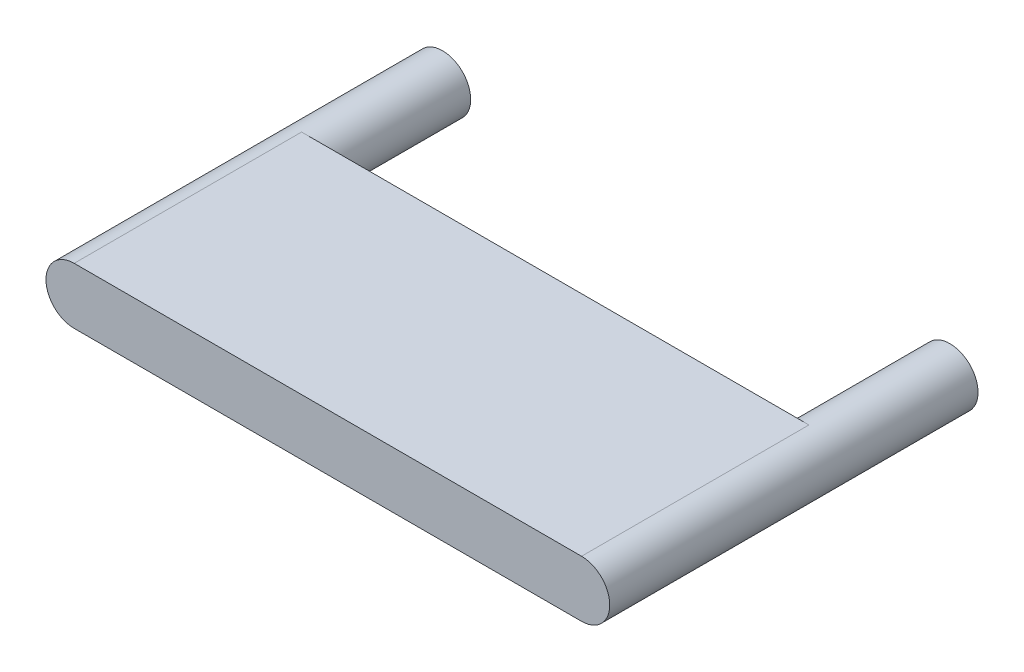
ISO-10303-21;
HEADER;
FILE_DESCRIPTION(('STEP AP214'),'2;1');
FILE_NAME('part.step','',(''),(''),'','','');
FILE_SCHEMA(('AUTOMOTIVE_DESIGN { 1 0 10303 214 1 1 1 1 }'));
ENDSEC;
DATA;
#1=APPLICATION_CONTEXT('core data for automotive mechanical design processes');
#2=APPLICATION_PROTOCOL_DEFINITION('international standard','automotive_design',2000,#1);
#3=PRODUCT_CONTEXT('',#1,'mechanical');
#4=PRODUCT('Part','Part','',(#3));
#5=PRODUCT_RELATED_PRODUCT_CATEGORY('part','',(#4));
#6=PRODUCT_DEFINITION_FORMATION('','',#4);
#7=PRODUCT_DEFINITION_CONTEXT('part definition',#1,'design');
#8=PRODUCT_DEFINITION('design','',#6,#7);
#9=PRODUCT_DEFINITION_SHAPE('','',#8);
#10=(LENGTH_UNIT() NAMED_UNIT(*) SI_UNIT(.MILLI.,.METRE.));
#11=(NAMED_UNIT(*) PLANE_ANGLE_UNIT() SI_UNIT($,.RADIAN.));
#12=(NAMED_UNIT(*) SI_UNIT($,.STERADIAN.) SOLID_ANGLE_UNIT());
#13=UNCERTAINTY_MEASURE_WITH_UNIT(LENGTH_MEASURE(1.E-05),#10,'distance_accuracy_value','');
#14=(GEOMETRIC_REPRESENTATION_CONTEXT(3) GLOBAL_UNCERTAINTY_ASSIGNED_CONTEXT((#13)) GLOBAL_UNIT_ASSIGNED_CONTEXT((#10,
#11,#12)) REPRESENTATION_CONTEXT('',''));
#15=CARTESIAN_POINT('',(0.,0.,0.));
#16=DIRECTION('',(0.,0.,1.));
#17=DIRECTION('',(1.,0.,0.));
#18=AXIS2_PLACEMENT_3D('',#15,#16,#17);
#19=CARTESIAN_POINT('',(22.86,2.54,12.7));
#20=DIRECTION('',(0.,0.,-1.));
#21=DIRECTION('',(-1.,0.,0.));
#22=AXIS2_PLACEMENT_3D('',#19,#20,#21);
#23=CYLINDRICAL_SURFACE('',#22,2.54);
#24=CARTESIAN_POINT('',(22.86,2.54,7.79060814735999));
#25=DIRECTION('',(0.,0.,-1.));
#26=DIRECTION('',(-1.,0.,0.));
#27=AXIS2_PLACEMENT_3D('',#24,#25,#26);
#28=CIRCLE('',#27,2.54);
#29=CARTESIAN_POINT('',(22.86,0.,7.79060814735999));
#30=VERTEX_POINT('',#29);
#31=CARTESIAN_POINT('',(22.86,5.08,7.79060814735999));
#32=VERTEX_POINT('',#31);
#33=EDGE_CURVE('E74',#30,#32,#28,.F.);
#34=ORIENTED_EDGE('',*,*,#33,.F.);
#35=DIRECTION('',(0.,0.,-1.));
#36=VECTOR('',#35,1.);
#37=CARTESIAN_POINT('',(22.86,0.,0.));
#38=LINE('',#37,#36);
#39=CARTESIAN_POINT('',(22.86,0.,-12.7));
#40=VERTEX_POINT('',#39);
#41=EDGE_CURVE('E82',#40,#30,#38,.F.);
#42=ORIENTED_EDGE('',*,*,#41,.F.);
#43=CARTESIAN_POINT('',(22.86,2.54,-12.7));
#44=DIRECTION('',(0.,0.,-1.));
#45=DIRECTION('',(-1.,0.,0.));
#46=AXIS2_PLACEMENT_3D('',#43,#44,#45);
#47=CIRCLE('',#46,2.54);
#48=CARTESIAN_POINT('',(22.86,5.08,-12.7));
#49=VERTEX_POINT('',#48);
#50=EDGE_CURVE('E42',#40,#49,#47,.T.);
#51=ORIENTED_EDGE('',*,*,#50,.T.);
#52=DIRECTION('',(0.,0.,1.));
#53=VECTOR('',#52,1.);
#54=CARTESIAN_POINT('',(22.86,5.08,12.7));
#55=LINE('',#54,#53);
#56=EDGE_CURVE('E84',#32,#49,#55,.F.);
#57=ORIENTED_EDGE('',*,*,#56,.F.);
#58=EDGE_LOOP('',(#34,#42,#51,#57));
#59=FACE_BOUND('',#58,.T.);
#60=CARTESIAN_POINT('',(22.86,2.54,-25.4));
#61=DIRECTION('',(0.,0.,-1.));
#62=DIRECTION('',(-1.,0.,0.));
#63=AXIS2_PLACEMENT_3D('',#60,#61,#62);
#64=CIRCLE('',#63,2.54);
#65=CARTESIAN_POINT('',(20.32,2.54,-25.4));
#66=VERTEX_POINT('',#65);
#67=EDGE_CURVE('E99',#66,#66,#64,.T.);
#68=ORIENTED_EDGE('',*,*,#67,.F.);
#69=EDGE_LOOP('',(#68));
#70=FACE_BOUND('',#69,.T.);
#71=ADVANCED_FACE('F34',(#59,#70),#23,.T.);
#72=CARTESIAN_POINT('',(-22.86,2.54,-12.7));
#73=DIRECTION('',(0.,0.,1.));
#74=DIRECTION('',(1.,0.,0.));
#75=AXIS2_PLACEMENT_3D('',#72,#73,#74);
#76=CYLINDRICAL_SURFACE('',#75,2.54);
#77=CARTESIAN_POINT('',(-22.86,2.54,7.79060814735999));
#78=DIRECTION('',(0.,0.,-1.));
#79=DIRECTION('',(-1.,0.,0.));
#80=AXIS2_PLACEMENT_3D('',#77,#78,#79);
#81=CIRCLE('',#80,2.54);
#82=CARTESIAN_POINT('',(-22.86,5.08,7.79060814735999));
#83=VERTEX_POINT('',#82);
#84=CARTESIAN_POINT('',(-22.86,0.,7.79060814735999));
#85=VERTEX_POINT('',#84);
#86=EDGE_CURVE('E49',#83,#85,#81,.F.);
#87=ORIENTED_EDGE('',*,*,#86,.F.);
#88=DIRECTION('',(0.,0.,-1.));
#89=VECTOR('',#88,1.);
#90=CARTESIAN_POINT('',(-22.86,5.08,-12.7));
#91=LINE('',#90,#89);
#92=CARTESIAN_POINT('',(-22.86,5.08,-12.7));
#93=VERTEX_POINT('',#92);
#94=EDGE_CURVE('E94',#93,#83,#91,.F.);
#95=ORIENTED_EDGE('',*,*,#94,.F.);
#96=CARTESIAN_POINT('',(-22.86,2.54,-12.7));
#97=DIRECTION('',(0.,0.,-1.));
#98=DIRECTION('',(-1.,0.,0.));
#99=AXIS2_PLACEMENT_3D('',#96,#97,#98);
#100=CIRCLE('',#99,2.54);
#101=CARTESIAN_POINT('',(-22.86,0.,-12.7));
#102=VERTEX_POINT('',#101);
#103=EDGE_CURVE('E85',#93,#102,#100,.T.);
#104=ORIENTED_EDGE('',*,*,#103,.T.);
#105=DIRECTION('',(0.,0.,1.));
#106=VECTOR('',#105,1.);
#107=CARTESIAN_POINT('',(-22.86,0.,0.));
#108=LINE('',#107,#106);
#109=EDGE_CURVE('E90',#85,#102,#108,.F.);
#110=ORIENTED_EDGE('',*,*,#109,.F.);
#111=EDGE_LOOP('',(#87,#95,#104,#110));
#112=FACE_BOUND('',#111,.T.);
#113=CARTESIAN_POINT('',(-22.86,2.54,-25.4));
#114=DIRECTION('',(0.,0.,-1.));
#115=DIRECTION('',(-1.,0.,0.));
#116=AXIS2_PLACEMENT_3D('',#113,#114,#115);
#117=CIRCLE('',#116,2.54);
#118=CARTESIAN_POINT('',(-25.4,2.54,-25.4));
#119=VERTEX_POINT('',#118);
#120=EDGE_CURVE('E104',#119,#119,#117,.T.);
#121=ORIENTED_EDGE('',*,*,#120,.F.);
#122=EDGE_LOOP('',(#121));
#123=FACE_BOUND('',#122,.T.);
#124=ADVANCED_FACE('F114',(#112,#123),#76,.T.);
#125=CARTESIAN_POINT('',(25.4,5.08,-12.7));
#126=DIRECTION('',(0.,0.,1.));
#127=DIRECTION('',(1.,0.,0.));
#128=AXIS2_PLACEMENT_3D('',#125,#126,#127);
#129=PLANE('',#128);
#130=ORIENTED_EDGE('',*,*,#103,.F.);
#131=DIRECTION('',(-1.,0.,0.));
#132=VECTOR('',#131,1.);
#133=CARTESIAN_POINT('',(25.4,5.08,-12.7));
#134=LINE('',#133,#132);
#135=EDGE_CURVE('E97',#49,#93,#134,.T.);
#136=ORIENTED_EDGE('',*,*,#135,.F.);
#137=ORIENTED_EDGE('',*,*,#50,.F.);
#138=DIRECTION('',(-1.,0.,0.));
#139=VECTOR('',#138,1.);
#140=CARTESIAN_POINT('',(25.4,0.,-12.7));
#141=LINE('',#140,#139);
#142=EDGE_CURVE('E88',#40,#102,#141,.T.);
#143=ORIENTED_EDGE('',*,*,#142,.T.);
#144=EDGE_LOOP('',(#130,#136,#137,#143));
#145=FACE_BOUND('',#144,.T.);
#146=ADVANCED_FACE('F117',(#145),#129,.F.);
#147=CARTESIAN_POINT('',(0.,5.08,0.));
#148=DIRECTION('',(0.,1.,0.));
#149=DIRECTION('',(0.,0.,1.));
#150=AXIS2_PLACEMENT_3D('',#147,#148,#149);
#151=PLANE('',#150);
#152=DIRECTION('',(-1.,0.,0.));
#153=VECTOR('',#152,1.);
#154=CARTESIAN_POINT('',(0.,5.08,7.79060814735999));
#155=LINE('',#154,#153);
#156=EDGE_CURVE('E110',#32,#83,#155,.T.);
#157=ORIENTED_EDGE('',*,*,#156,.F.);
#158=ORIENTED_EDGE('',*,*,#56,.T.);
#159=ORIENTED_EDGE('',*,*,#135,.T.);
#160=ORIENTED_EDGE('',*,*,#94,.T.);
#161=EDGE_LOOP('',(#157,#158,#159,#160));
#162=FACE_BOUND('',#161,.T.);
#163=ADVANCED_FACE('F116',(#162),#151,.T.);
#164=CARTESIAN_POINT('',(0.,0.,0.));
#165=DIRECTION('',(0.,1.,0.));
#166=DIRECTION('',(0.,0.,1.));
#167=AXIS2_PLACEMENT_3D('',#164,#165,#166);
#168=PLANE('',#167);
#169=ORIENTED_EDGE('',*,*,#41,.T.);
#170=DIRECTION('',(-1.,0.,0.));
#171=VECTOR('',#170,1.);
#172=CARTESIAN_POINT('',(0.,0.,7.79060814735999));
#173=LINE('',#172,#171);
#174=EDGE_CURVE('E11',#30,#85,#173,.T.);
#175=ORIENTED_EDGE('',*,*,#174,.T.);
#176=ORIENTED_EDGE('',*,*,#109,.T.);
#177=ORIENTED_EDGE('',*,*,#142,.F.);
#178=EDGE_LOOP('',(#169,#175,#176,#177));
#179=FACE_BOUND('',#178,.T.);
#180=ADVANCED_FACE('F87',(#179),#168,.F.);
#181=CARTESIAN_POINT('',(22.86,2.54,-25.4));
#182=DIRECTION('',(0.,0.,-1.));
#183=DIRECTION('',(-1.,0.,0.));
#184=AXIS2_PLACEMENT_3D('',#181,#182,#183);
#185=PLANE('',#184);
#186=ORIENTED_EDGE('',*,*,#67,.T.);
#187=EDGE_LOOP('',(#186));
#188=FACE_BOUND('',#187,.T.);
#189=ADVANCED_FACE('F153',(#188),#185,.T.);
#190=CARTESIAN_POINT('',(-22.86,2.54,-25.4));
#191=DIRECTION('',(0.,0.,-1.));
#192=DIRECTION('',(-1.,0.,0.));
#193=AXIS2_PLACEMENT_3D('',#190,#191,#192);
#194=PLANE('',#193);
#195=ORIENTED_EDGE('',*,*,#120,.T.);
#196=EDGE_LOOP('',(#195));
#197=FACE_BOUND('',#196,.T.);
#198=ADVANCED_FACE('F161',(#197),#194,.T.);
#199=CARTESIAN_POINT('',(-26.4384663482815,12.7,7.79060814735999));
#200=DIRECTION('',(0.,0.,-1.));
#201=DIRECTION('',(-1.,0.,0.));
#202=AXIS2_PLACEMENT_3D('',#199,#200,#201);
#203=PLANE('',#202);
#204=ORIENTED_EDGE('',*,*,#33,.T.);
#205=ORIENTED_EDGE('',*,*,#156,.T.);
#206=ORIENTED_EDGE('',*,*,#86,.T.);
#207=ORIENTED_EDGE('',*,*,#174,.F.);
#208=EDGE_LOOP('',(#204,#205,#206,#207));
#209=FACE_BOUND('',#208,.T.);
#210=ADVANCED_FACE('F73',(#209),#203,.F.);
#211=CLOSED_SHELL('',(#71,#124,#146,#163,#180,#189,#198,#210));
#212=MANIFOLD_SOLID_BREP('B2',#211);
#213=ADVANCED_BREP_SHAPE_REPRESENTATION('',(#18,#212),#14);
#214=SHAPE_DEFINITION_REPRESENTATION(#9,#213);
ENDSEC;
END-ISO-10303-21;
